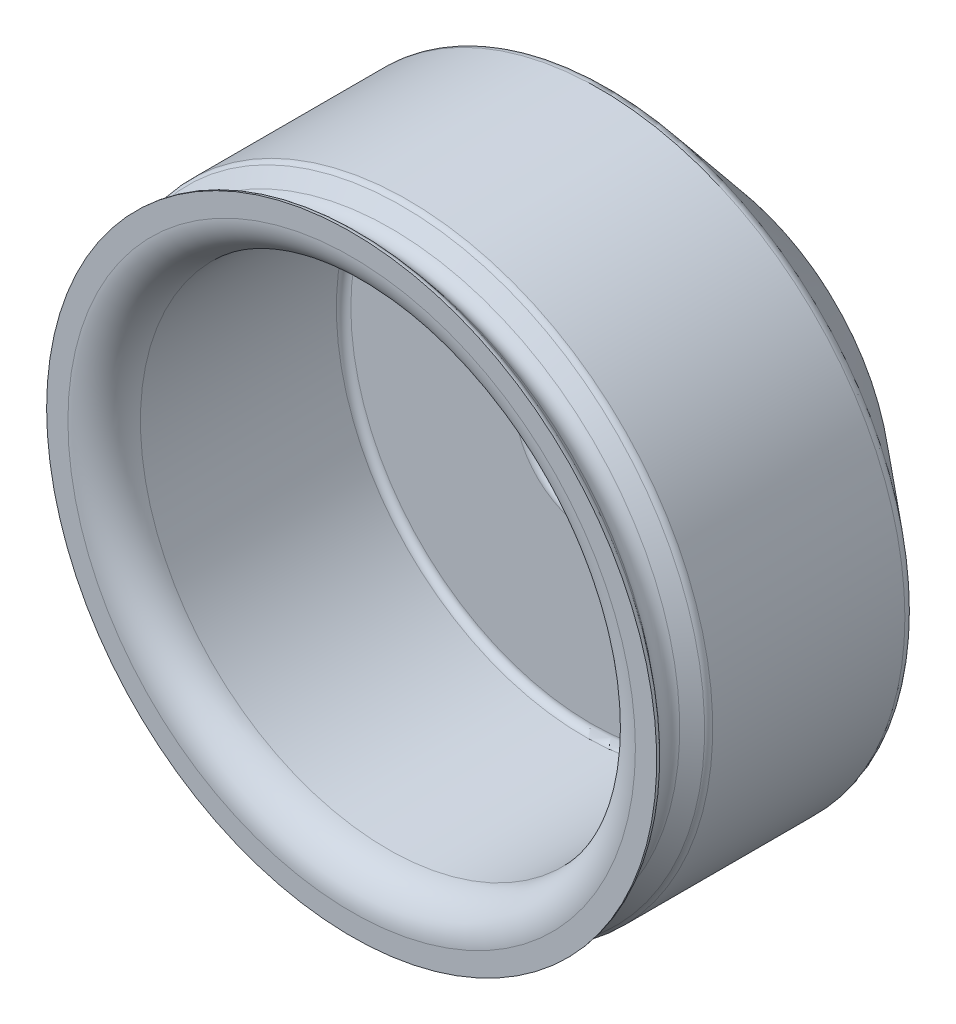
ISO-10303-21;
HEADER;
FILE_DESCRIPTION(('STEP AP214'),'2;1');
FILE_NAME('part.step','',(''),(''),'','','');
FILE_SCHEMA(('AUTOMOTIVE_DESIGN { 1 0 10303 214 1 1 1 1 }'));
ENDSEC;
DATA;
#1=APPLICATION_CONTEXT('core data for automotive mechanical design processes');
#2=APPLICATION_PROTOCOL_DEFINITION('international standard','automotive_design',2000,#1);
#3=PRODUCT_CONTEXT('',#1,'mechanical');
#4=PRODUCT('Part','Part','',(#3));
#5=PRODUCT_RELATED_PRODUCT_CATEGORY('part','',(#4));
#6=PRODUCT_DEFINITION_FORMATION('','',#4);
#7=PRODUCT_DEFINITION_CONTEXT('part definition',#1,'design');
#8=PRODUCT_DEFINITION('design','',#6,#7);
#9=PRODUCT_DEFINITION_SHAPE('','',#8);
#10=(LENGTH_UNIT() NAMED_UNIT(*) SI_UNIT(.MILLI.,.METRE.));
#11=(NAMED_UNIT(*) PLANE_ANGLE_UNIT() SI_UNIT($,.RADIAN.));
#12=(NAMED_UNIT(*) SI_UNIT($,.STERADIAN.) SOLID_ANGLE_UNIT());
#13=UNCERTAINTY_MEASURE_WITH_UNIT(LENGTH_MEASURE(1.E-05),#10,'distance_accuracy_value','');
#14=(GEOMETRIC_REPRESENTATION_CONTEXT(3) GLOBAL_UNCERTAINTY_ASSIGNED_CONTEXT((#13)) GLOBAL_UNIT_ASSIGNED_CONTEXT((#10,
#11,#12)) REPRESENTATION_CONTEXT('',''));
#15=CARTESIAN_POINT('',(0.,0.,0.));
#16=DIRECTION('',(0.,0.,1.));
#17=DIRECTION('',(1.,0.,0.));
#18=AXIS2_PLACEMENT_3D('',#15,#16,#17);
#19=CARTESIAN_POINT('',(0.,0.,0.));
#20=DIRECTION('',(0.,0.,1.));
#21=DIRECTION('',(1.,0.,0.));
#22=AXIS2_PLACEMENT_3D('',#19,#20,#21);
#23=PLANE('',#22);
#24=DIRECTION('',(-1.,0.,0.));
#25=VECTOR('',#24,1.);
#26=CARTESIAN_POINT('',(-1.61844048392272,2.0859,0.));
#27=LINE('',#26,#25);
#28=CARTESIAN_POINT('',(1.86354221846461,2.0859,0.));
#29=VERTEX_POINT('',#28);
#30=CARTESIAN_POINT('',(-1.86354221846461,2.0859,0.));
#31=VERTEX_POINT('',#30);
#32=EDGE_CURVE('E189',#29,#31,#27,.T.);
#33=ORIENTED_EDGE('',*,*,#32,.T.);
#34=CARTESIAN_POINT('',(0.,0.,0.));
#35=DIRECTION('',(0.,0.,1.));
#36=DIRECTION('',(1.,0.,0.));
#37=AXIS2_PLACEMENT_3D('',#34,#35,#36);
#38=CIRCLE('',#37,2.7971);
#39=EDGE_CURVE('E186',#31,#29,#38,.T.);
#40=ORIENTED_EDGE('',*,*,#39,.T.);
#41=EDGE_LOOP('',(#33,#40));
#42=FACE_BOUND('',#41,.T.);
#43=CARTESIAN_POINT('',(0.,0.,0.));
#44=DIRECTION('',(0.,0.,1.));
#45=DIRECTION('',(1.,0.,0.));
#46=AXIS2_PLACEMENT_3D('',#43,#44,#45);
#47=CIRCLE('',#46,9.94959878402376);
#48=CARTESIAN_POINT('',(9.94959878402376,0.,0.));
#49=VERTEX_POINT('',#48);
#50=EDGE_CURVE('E191',#49,#49,#47,.F.);
#51=ORIENTED_EDGE('',*,*,#50,.T.);
#52=EDGE_LOOP('',(#51));
#53=FACE_BOUND('',#52,.T.);
#54=ADVANCED_FACE('F33',(#42,#53),#23,.F.);
#55=CARTESIAN_POINT('',(0.,0.,3.175));
#56=DIRECTION('',(0.,0.,1.));
#57=DIRECTION('',(1.,0.,0.));
#58=AXIS2_PLACEMENT_3D('',#55,#56,#57);
#59=PLANE('',#58);
#60=DIRECTION('',(-1.,0.,0.));
#61=VECTOR('',#60,1.);
#62=CARTESIAN_POINT('',(0.,1.8859,3.175));
#63=LINE('',#62,#61);
#64=CARTESIAN_POINT('',(-1.78558382609162,1.8859,3.175));
#65=VERTEX_POINT('',#64);
#66=CARTESIAN_POINT('',(1.78558382609162,1.8859,3.175));
#67=VERTEX_POINT('',#66);
#68=EDGE_CURVE('E104',#65,#67,#63,.F.);
#69=ORIENTED_EDGE('',*,*,#68,.T.);
#70=CARTESIAN_POINT('',(0.,0.,3.175));
#71=DIRECTION('',(0.,0.,1.));
#72=DIRECTION('',(1.,0.,0.));
#73=AXIS2_PLACEMENT_3D('',#70,#71,#72);
#74=CIRCLE('',#73,2.5971);
#75=EDGE_CURVE('E91',#67,#65,#74,.F.);
#76=ORIENTED_EDGE('',*,*,#75,.T.);
#77=EDGE_LOOP('',(#69,#76));
#78=FACE_BOUND('',#77,.T.);
#79=CARTESIAN_POINT('',(0.,0.,3.175));
#80=DIRECTION('',(0.,0.,1.));
#81=DIRECTION('',(1.,0.,0.));
#82=AXIS2_PLACEMENT_3D('',#79,#80,#81);
#83=CIRCLE('',#82,3.41);
#84=CARTESIAN_POINT('',(3.41,0.,3.175));
#85=VERTEX_POINT('',#84);
#86=EDGE_CURVE('E112',#85,#85,#83,.T.);
#87=ORIENTED_EDGE('',*,*,#86,.T.);
#88=EDGE_LOOP('',(#87));
#89=FACE_BOUND('',#88,.T.);
#90=ADVANCED_FACE('F242',(#78,#89),#59,.T.);
#91=CARTESIAN_POINT('',(0.,0.,3.175));
#92=DIRECTION('',(0.,0.,-1.));
#93=DIRECTION('',(-1.,0.,0.));
#94=AXIS2_PLACEMENT_3D('',#91,#92,#93);
#95=CYLINDRICAL_SURFACE('',#94,2.1971);
#96=DIRECTION('',(0.,0.,-1.));
#97=VECTOR('',#96,1.);
#98=CARTESIAN_POINT('',(1.61844048392272,1.4859,3.175));
#99=LINE('',#98,#97);
#100=CARTESIAN_POINT('',(1.61844048392272,1.4859,2.775));
#101=VERTEX_POINT('',#100);
#102=CARTESIAN_POINT('',(1.61844048392272,1.4859,0.6));
#103=VERTEX_POINT('',#102);
#104=EDGE_CURVE('E85',#101,#103,#99,.T.);
#105=ORIENTED_EDGE('',*,*,#104,.T.);
#106=CARTESIAN_POINT('',(0.,0.,0.6));
#107=DIRECTION('',(0.,0.,1.));
#108=DIRECTION('',(1.,0.,0.));
#109=AXIS2_PLACEMENT_3D('',#106,#107,#108);
#110=CIRCLE('',#109,2.1971);
#111=CARTESIAN_POINT('',(-1.61844048392272,1.4859,0.6));
#112=VERTEX_POINT('',#111);
#113=EDGE_CURVE('E98',#103,#112,#110,.F.);
#114=ORIENTED_EDGE('',*,*,#113,.T.);
#115=DIRECTION('',(0.,0.,-1.));
#116=VECTOR('',#115,1.);
#117=CARTESIAN_POINT('',(-1.61844048392272,1.4859,3.175));
#118=LINE('',#117,#116);
#119=CARTESIAN_POINT('',(-1.61844048392272,1.4859,2.775));
#120=VERTEX_POINT('',#119);
#121=EDGE_CURVE('E84',#120,#112,#118,.T.);
#122=ORIENTED_EDGE('',*,*,#121,.F.);
#123=CARTESIAN_POINT('',(0.,0.,2.775));
#124=DIRECTION('',(0.,0.,1.));
#125=DIRECTION('',(1.,0.,0.));
#126=AXIS2_PLACEMENT_3D('',#123,#124,#125);
#127=CIRCLE('',#126,2.1971);
#128=EDGE_CURVE('E97',#120,#101,#127,.T.);
#129=ORIENTED_EDGE('',*,*,#128,.T.);
#130=EDGE_LOOP('',(#105,#114,#122,#129));
#131=FACE_BOUND('',#130,.T.);
#132=ADVANCED_FACE('F95',(#131),#95,.F.);
#133=CARTESIAN_POINT('',(-1.61844048392272,1.4859,3.175));
#134=DIRECTION('',(0.,-1.,0.));
#135=DIRECTION('',(0.,0.,-1.));
#136=AXIS2_PLACEMENT_3D('',#133,#134,#135);
#137=PLANE('',#136);
#138=ORIENTED_EDGE('',*,*,#121,.T.);
#139=DIRECTION('',(-1.,0.,0.));
#140=VECTOR('',#139,1.);
#141=CARTESIAN_POINT('',(1.61844048392272,1.4859,0.6));
#142=LINE('',#141,#140);
#143=EDGE_CURVE('E55',#112,#103,#142,.F.);
#144=ORIENTED_EDGE('',*,*,#143,.T.);
#145=ORIENTED_EDGE('',*,*,#104,.F.);
#146=DIRECTION('',(-1.,0.,0.));
#147=VECTOR('',#146,1.);
#148=CARTESIAN_POINT('',(-1.61844048392272,1.4859,2.775));
#149=LINE('',#148,#147);
#150=EDGE_CURVE('E81',#101,#120,#149,.T.);
#151=ORIENTED_EDGE('',*,*,#150,.T.);
#152=EDGE_LOOP('',(#138,#144,#145,#151));
#153=FACE_BOUND('',#152,.T.);
#154=ADVANCED_FACE('F83',(#153),#137,.T.);
#155=CARTESIAN_POINT('',(0.,0.,6.35));
#156=DIRECTION('',(0.,0.,1.));
#157=DIRECTION('',(1.,0.,0.));
#158=AXIS2_PLACEMENT_3D('',#155,#156,#157);
#159=PLANE('',#158);
#160=CARTESIAN_POINT('',(0.,0.,6.35));
#161=DIRECTION('',(0.,0.,1.));
#162=DIRECTION('',(1.,0.,0.));
#163=AXIS2_PLACEMENT_3D('',#160,#161,#162);
#164=CIRCLE('',#163,4.21);
#165=CARTESIAN_POINT('',(4.21,0.,6.35));
#166=VERTEX_POINT('',#165);
#167=EDGE_CURVE('E128',#166,#166,#164,.F.);
#168=ORIENTED_EDGE('',*,*,#167,.T.);
#169=EDGE_LOOP('',(#168));
#170=FACE_BOUND('',#169,.T.);
#171=CARTESIAN_POINT('',(0.,0.,6.35));
#172=DIRECTION('',(0.,0.,1.));
#173=DIRECTION('',(1.,0.,0.));
#174=AXIS2_PLACEMENT_3D('',#171,#172,#173);
#175=CIRCLE('',#174,13.2525);
#176=CARTESIAN_POINT('',(13.2525,0.,6.35));
#177=VERTEX_POINT('',#176);
#178=EDGE_CURVE('E125',#177,#177,#175,.T.);
#179=ORIENTED_EDGE('',*,*,#178,.T.);
#180=EDGE_LOOP('',(#179));
#181=FACE_BOUND('',#180,.T.);
#182=ADVANCED_FACE('F255',(#170,#181),#159,.T.);
#183=CARTESIAN_POINT('',(0.,0.,6.35));
#184=DIRECTION('',(0.,0.,-1.));
#185=DIRECTION('',(-1.,0.,0.));
#186=AXIS2_PLACEMENT_3D('',#183,#184,#185);
#187=CYLINDRICAL_SURFACE('',#186,3.81);
#188=CARTESIAN_POINT('',(0.,0.,3.575));
#189=DIRECTION('',(0.,0.,1.));
#190=DIRECTION('',(1.,0.,0.));
#191=AXIS2_PLACEMENT_3D('',#188,#189,#190);
#192=CIRCLE('',#191,3.81);
#193=CARTESIAN_POINT('',(3.81,0.,3.575));
#194=VERTEX_POINT('',#193);
#195=EDGE_CURVE('E122',#194,#194,#192,.F.);
#196=ORIENTED_EDGE('',*,*,#195,.T.);
#197=EDGE_LOOP('',(#196));
#198=FACE_BOUND('',#197,.T.);
#199=CARTESIAN_POINT('',(0.,0.,5.95));
#200=DIRECTION('',(0.,0.,1.));
#201=DIRECTION('',(1.,0.,0.));
#202=AXIS2_PLACEMENT_3D('',#199,#200,#201);
#203=CIRCLE('',#202,3.81);
#204=CARTESIAN_POINT('',(3.81,0.,5.95));
#205=VERTEX_POINT('',#204);
#206=EDGE_CURVE('E90',#205,#205,#203,.T.);
#207=ORIENTED_EDGE('',*,*,#206,.T.);
#208=EDGE_LOOP('',(#207));
#209=FACE_BOUND('',#208,.T.);
#210=ADVANCED_FACE('F258',(#198,#209),#187,.F.);
#211=CARTESIAN_POINT('',(0.,0.,0.));
#212=DIRECTION('',(0.,0.,-1.));
#213=DIRECTION('',(-1.,0.,0.));
#214=AXIS2_PLACEMENT_3D('',#211,#212,#213);
#215=CYLINDRICAL_SURFACE('',#214,13.6525);
#216=CARTESIAN_POINT('',(0.,0.,17.558));
#217=DIRECTION('',(0.,0.,1.));
#218=DIRECTION('',(1.,0.,0.));
#219=AXIS2_PLACEMENT_3D('',#216,#217,#218);
#220=CIRCLE('',#219,13.6525);
#221=CARTESIAN_POINT('',(13.6525,0.,17.558));
#222=VERTEX_POINT('',#221);
#223=EDGE_CURVE('E194',#222,#222,#220,.T.);
#224=ORIENTED_EDGE('',*,*,#223,.T.);
#225=EDGE_LOOP('',(#224));
#226=FACE_BOUND('',#225,.T.);
#227=CARTESIAN_POINT('',(0.,0.,6.75));
#228=DIRECTION('',(0.,0.,1.));
#229=DIRECTION('',(1.,0.,0.));
#230=AXIS2_PLACEMENT_3D('',#227,#228,#229);
#231=CIRCLE('',#230,13.6525);
#232=CARTESIAN_POINT('',(13.6525,0.,6.75));
#233=VERTEX_POINT('',#232);
#234=EDGE_CURVE('E131',#233,#233,#231,.F.);
#235=ORIENTED_EDGE('',*,*,#234,.T.);
#236=EDGE_LOOP('',(#235));
#237=FACE_BOUND('',#236,.T.);
#238=ADVANCED_FACE('F204',(#226,#237),#215,.F.);
#239=CARTESIAN_POINT('',(0.,13.6525,19.558));
#240=DIRECTION('',(0.,0.,1.));
#241=DIRECTION('',(1.,0.,0.));
#242=AXIS2_PLACEMENT_3D('',#239,#240,#241);
#243=PLANE('',#242);
#244=CARTESIAN_POINT('',(0.,0.,19.558));
#245=DIRECTION('',(0.,0.,1.));
#246=DIRECTION('',(1.,0.,0.));
#247=AXIS2_PLACEMENT_3D('',#244,#245,#246);
#248=CIRCLE('',#247,15.6525);
#249=CARTESIAN_POINT('',(15.6525,0.,19.558));
#250=VERTEX_POINT('',#249);
#251=EDGE_CURVE('E134',#250,#250,#248,.F.);
#252=ORIENTED_EDGE('',*,*,#251,.T.);
#253=EDGE_LOOP('',(#252));
#254=FACE_BOUND('',#253,.T.);
#255=CARTESIAN_POINT('',(0.,0.,19.558));
#256=DIRECTION('',(0.,0.,-1.));
#257=DIRECTION('',(-1.,0.,0.));
#258=AXIS2_PLACEMENT_3D('',#255,#256,#257);
#259=CIRCLE('',#258,16.8275);
#260=CARTESIAN_POINT('',(-16.8275,0.,19.558));
#261=VERTEX_POINT('',#260);
#262=EDGE_CURVE('E99',#261,#261,#259,.T.);
#263=ORIENTED_EDGE('',*,*,#262,.F.);
#264=EDGE_LOOP('',(#263));
#265=FACE_BOUND('',#264,.T.);
#266=ADVANCED_FACE('F199',(#254,#265),#243,.T.);
#267=CARTESIAN_POINT('',(0.,0.,19.558));
#268=DIRECTION('',(0.,0.,-1.));
#269=DIRECTION('',(-1.,0.,0.));
#270=AXIS2_PLACEMENT_3D('',#267,#268,#269);
#271=TOROIDAL_SURFACE('',#270,16.4275,0.400000000000002);
#272=ORIENTED_EDGE('',*,*,#262,.T.);
#273=EDGE_LOOP('',(#272));
#274=FACE_BOUND('',#273,.T.);
#275=CARTESIAN_POINT('',(0.,0.,19.2515822227524));
#276=DIRECTION('',(0.,0.,-1.));
#277=DIRECTION('',(-1.,0.,0.));
#278=AXIS2_PLACEMENT_3D('',#275,#276,#277);
#279=CIRCLE('',#278,16.6846150438746);
#280=CARTESIAN_POINT('',(-16.6846150438746,0.,19.2515822227524));
#281=VERTEX_POINT('',#280);
#282=EDGE_CURVE('E209',#281,#281,#279,.T.);
#283=ORIENTED_EDGE('',*,*,#282,.F.);
#284=EDGE_LOOP('',(#283));
#285=FACE_BOUND('',#284,.T.);
#286=ADVANCED_FACE('F203',(#274,#285),#271,.T.);
#287=CARTESIAN_POINT('',(0.,0.,18.6253242980759));
#288=DIRECTION('',(0.,0.,1.));
#289=DIRECTION('',(1.,0.,0.));
#290=AXIS2_PLACEMENT_3D('',#287,#288,#289);
#291=CONICAL_SURFACE('',#290,15.9382699122508,0.872664625997176);
#292=ORIENTED_EDGE('',*,*,#282,.T.);
#293=EDGE_LOOP('',(#292));
#294=FACE_BOUND('',#293,.T.);
#295=CARTESIAN_POINT('',(0.,0.,18.6253242980759));
#296=DIRECTION('',(0.,0.,-1.));
#297=DIRECTION('',(-1.,0.,0.));
#298=AXIS2_PLACEMENT_3D('',#295,#296,#297);
#299=CIRCLE('',#298,15.9382699122508);
#300=CARTESIAN_POINT('',(-15.9382699122508,0.,18.6253242980759));
#301=VERTEX_POINT('',#300);
#302=EDGE_CURVE('E212',#301,#301,#299,.T.);
#303=ORIENTED_EDGE('',*,*,#302,.F.);
#304=EDGE_LOOP('',(#303));
#305=FACE_BOUND('',#304,.T.);
#306=ADVANCED_FACE('F268',(#294,#305),#291,.T.);
#307=CARTESIAN_POINT('',(0.,0.,18.0124887435807));
#308=DIRECTION('',(0.,0.,-1.));
#309=DIRECTION('',(-1.,0.,0.));
#310=AXIS2_PLACEMENT_3D('',#307,#308,#309);
#311=TOROIDAL_SURFACE('',#310,16.4525,0.800000000000003);
#312=ORIENTED_EDGE('',*,*,#302,.T.);
#313=EDGE_LOOP('',(#312));
#314=FACE_BOUND('',#313,.T.);
#315=CARTESIAN_POINT('',(0.,0.,17.3996531890855));
#316=DIRECTION('',(0.,0.,-1.));
#317=DIRECTION('',(-1.,0.,0.));
#318=AXIS2_PLACEMENT_3D('',#315,#316,#317);
#319=CIRCLE('',#318,15.9382699122508);
#320=CARTESIAN_POINT('',(-15.9382699122508,0.,17.3996531890855));
#321=VERTEX_POINT('',#320);
#322=EDGE_CURVE('E217',#321,#321,#319,.T.);
#323=ORIENTED_EDGE('',*,*,#322,.F.);
#324=EDGE_LOOP('',(#323));
#325=FACE_BOUND('',#324,.T.);
#326=ADVANCED_FACE('F238',(#314,#325),#311,.F.);
#327=CARTESIAN_POINT('',(0.,0.,16.773395264409));
#328=DIRECTION('',(0.,0.,-1.));
#329=DIRECTION('',(-1.,0.,0.));
#330=AXIS2_PLACEMENT_3D('',#327,#328,#329);
#331=CONICAL_SURFACE('',#330,16.6846150438746,0.872664625997173);
#332=ORIENTED_EDGE('',*,*,#322,.T.);
#333=EDGE_LOOP('',(#332));
#334=FACE_BOUND('',#333,.T.);
#335=CARTESIAN_POINT('',(0.,0.,16.773395264409));
#336=DIRECTION('',(0.,0.,-1.));
#337=DIRECTION('',(-1.,0.,0.));
#338=AXIS2_PLACEMENT_3D('',#335,#336,#337);
#339=CIRCLE('',#338,16.6846150438746);
#340=CARTESIAN_POINT('',(-16.6846150438746,0.,16.773395264409));
#341=VERTEX_POINT('',#340);
#342=EDGE_CURVE('E220',#341,#341,#339,.T.);
#343=ORIENTED_EDGE('',*,*,#342,.F.);
#344=EDGE_LOOP('',(#343));
#345=FACE_BOUND('',#344,.T.);
#346=ADVANCED_FACE('F229',(#334,#345),#331,.T.);
#347=CARTESIAN_POINT('',(0.,0.,16.4669774871614));
#348=DIRECTION('',(0.,0.,-1.));
#349=DIRECTION('',(-1.,0.,0.));
#350=AXIS2_PLACEMENT_3D('',#347,#348,#349);
#351=TOROIDAL_SURFACE('',#350,16.4275,0.400000000000004);
#352=ORIENTED_EDGE('',*,*,#342,.T.);
#353=EDGE_LOOP('',(#352));
#354=FACE_BOUND('',#353,.T.);
#355=CARTESIAN_POINT('',(0.,0.,16.4669774871614));
#356=DIRECTION('',(0.,0.,-1.));
#357=DIRECTION('',(-1.,0.,0.));
#358=AXIS2_PLACEMENT_3D('',#355,#356,#357);
#359=CIRCLE('',#358,16.8275);
#360=CARTESIAN_POINT('',(-16.8275,0.,16.4669774871614));
#361=VERTEX_POINT('',#360);
#362=EDGE_CURVE('E108',#361,#361,#359,.T.);
#363=ORIENTED_EDGE('',*,*,#362,.F.);
#364=EDGE_LOOP('',(#363));
#365=FACE_BOUND('',#364,.T.);
#366=ADVANCED_FACE('F227',(#354,#365),#351,.T.);
#367=CARTESIAN_POINT('',(0.,0.,0.));
#368=DIRECTION('',(0.,0.,-1.));
#369=DIRECTION('',(-1.,0.,0.));
#370=AXIS2_PLACEMENT_3D('',#367,#368,#369);
#371=CYLINDRICAL_SURFACE('',#370,16.8275);
#372=CARTESIAN_POINT('',(0.,0.,5.867784594893));
#373=DIRECTION('',(0.,0.,1.));
#374=DIRECTION('',(1.,0.,0.));
#375=AXIS2_PLACEMENT_3D('',#372,#373,#374);
#376=CIRCLE('',#375,16.8275);
#377=CARTESIAN_POINT('',(16.8275,0.,5.867784594893));
#378=VERTEX_POINT('',#377);
#379=EDGE_CURVE('E11',#378,#378,#376,.T.);
#380=ORIENTED_EDGE('',*,*,#379,.T.);
#381=EDGE_LOOP('',(#380));
#382=FACE_BOUND('',#381,.T.);
#383=ORIENTED_EDGE('',*,*,#362,.T.);
#384=EDGE_LOOP('',(#383));
#385=FACE_BOUND('',#384,.T.);
#386=ADVANCED_FACE('F149',(#382,#385),#371,.T.);
#387=CARTESIAN_POINT('',(-1.61844048392272,1.8859,2.775));
#388=DIRECTION('',(-1.,0.,0.));
#389=DIRECTION('',(0.,0.,1.));
#390=AXIS2_PLACEMENT_3D('',#387,#388,#389);
#391=CYLINDRICAL_SURFACE('',#390,0.4);
#392=CARTESIAN_POINT('',(1.61844048392272,1.4859,2.775));
#393=CARTESIAN_POINT('',(1.6184279251195,1.48587573243473,2.79617683701473));
#394=CARTESIAN_POINT('',(1.61917873967295,1.48758000154117,2.81733593506487));
#395=CARTESIAN_POINT('',(1.62210805299891,1.49425292577185,2.85896553890415));
#396=CARTESIAN_POINT('',(1.6242820502049,1.4992112882317,2.87943800261027));
#397=CARTESIAN_POINT('',(1.62995857522217,1.51219910536874,2.9191734314972));
#398=CARTESIAN_POINT('',(1.63346053515159,1.52022724731647,2.93843690958296));
#399=CARTESIAN_POINT('',(1.64163303116618,1.53904444357606,2.97529844578131));
#400=CARTESIAN_POINT('',(1.64630414189129,1.54983485560873,2.9928956790518));
#401=CARTESIAN_POINT('',(1.65681963784184,1.57425292489883,3.0266460617728));
#402=CARTESIAN_POINT('',(1.66270059258753,1.58796968749708,3.04272316282571));
#403=CARTESIAN_POINT('',(1.6753069572211,1.6175535979896,3.0723703540475));
#404=CARTESIAN_POINT('',(1.68203265628696,1.63342148241718,3.08593958175576));
#405=CARTESIAN_POINT('',(1.6966787362034,1.66820556178198,3.11131622850045));
#406=CARTESIAN_POINT('',(1.70465155742049,1.68726368856272,3.12289871021104));
#407=CARTESIAN_POINT('',(1.72109369570914,1.72686341330359,3.14269202334142));
#408=CARTESIAN_POINT('',(1.72956315862959,1.74740544745806,3.1509018585912));
#409=CARTESIAN_POINT('',(1.74566832507443,1.78676600737856,3.16299628692281));
#410=CARTESIAN_POINT('',(1.75327295204829,1.80547114153928,3.16729837974999));
#411=CARTESIAN_POINT('',(1.7685330007565,1.84325474728501,3.17317791136736));
#412=CARTESIAN_POINT('',(1.77618828947558,1.86233239182,3.17476081579639));
#413=CARTESIAN_POINT('',(1.78439356963569,1.88291240766148,3.17499165076643));
#414=CARTESIAN_POINT('',(1.78498885626196,1.88440622451286,3.17500002114534));
#415=CARTESIAN_POINT('',(1.78558382609162,1.8859,3.175));
#416=B_SPLINE_CURVE_WITH_KNOTS('',3,(#392,#393,#394,#395,#396,#397,#398,#399,#400,#401,#402,
#403,#404,#405,#406,#407,#408,#409,#410,#411,#412,#413,#414,#415),.UNSPECIFIED.,.F.,.F.,(4,2,2,
2,2,2,2,2,2,2,2,4),(0.,0.0634211449991186,0.126642650147228,0.189837150070465,0.253062771419776,
0.318593704247308,0.384147131476207,0.454897202520991,0.525668155835106,0.587431892490301,
0.649071336544128,0.653895478651192),.UNSPECIFIED.);
#417=EDGE_CURVE('E109',#67,#101,#416,.F.);
#418=ORIENTED_EDGE('',*,*,#417,.F.);
#419=ORIENTED_EDGE('',*,*,#68,.F.);
#420=CARTESIAN_POINT('',(-1.61844048392272,1.4859,2.775));
#421=CARTESIAN_POINT('',(-1.6184279251195,1.48587573243473,2.79617683701473));
#422=CARTESIAN_POINT('',(-1.61917873967295,1.48758000154117,2.81733593506487));
#423=CARTESIAN_POINT('',(-1.62210805299891,1.49425292577185,2.85896553890415));
#424=CARTESIAN_POINT('',(-1.6242820502049,1.4992112882317,2.87943800261027));
#425=CARTESIAN_POINT('',(-1.62995857522217,1.51219910536874,2.9191734314972));
#426=CARTESIAN_POINT('',(-1.63346053515159,1.52022724731647,2.93843690958296));
#427=CARTESIAN_POINT('',(-1.64163303116618,1.53904444357606,2.97529844578131));
#428=CARTESIAN_POINT('',(-1.64630414189129,1.54983485560873,2.9928956790518));
#429=CARTESIAN_POINT('',(-1.65681963784184,1.57425292489883,3.0266460617728));
#430=CARTESIAN_POINT('',(-1.66270059258753,1.58796968749708,3.04272316282571));
#431=CARTESIAN_POINT('',(-1.6753069572211,1.6175535979896,3.0723703540475));
#432=CARTESIAN_POINT('',(-1.68203265628696,1.63342148241718,3.08593958175576));
#433=CARTESIAN_POINT('',(-1.6966787362034,1.66820556178198,3.11131622850045));
#434=CARTESIAN_POINT('',(-1.70465155742049,1.68726368856272,3.12289871021104));
#435=CARTESIAN_POINT('',(-1.72109369570914,1.72686341330359,3.14269202334142));
#436=CARTESIAN_POINT('',(-1.72956315862959,1.74740544745806,3.1509018585912));
#437=CARTESIAN_POINT('',(-1.74566832507443,1.78676600737856,3.16299628692281));
#438=CARTESIAN_POINT('',(-1.75327295204829,1.80547114153928,3.16729837974999));
#439=CARTESIAN_POINT('',(-1.7685330007565,1.84325474728501,3.17317791136736));
#440=CARTESIAN_POINT('',(-1.77618828947558,1.86233239182,3.17476081579639));
#441=CARTESIAN_POINT('',(-1.78439356963569,1.88291240766148,3.17499165076643));
#442=CARTESIAN_POINT('',(-1.78498885626196,1.88440622451286,3.17500002114534));
#443=CARTESIAN_POINT('',(-1.78558382609162,1.8859,3.175));
#444=B_SPLINE_CURVE_WITH_KNOTS('',3,(#420,#421,#422,#423,#424,#425,#426,#427,#428,#429,#430,
#431,#432,#433,#434,#435,#436,#437,#438,#439,#440,#441,#442,#443),.UNSPECIFIED.,.F.,.F.,(4,2,2,
2,2,2,2,2,2,2,2,4),(0.,0.0634211449991186,0.126642650147228,0.189837150070465,0.253062771419776,
0.318593704247308,0.384147131476207,0.454897202520991,0.525668155835106,0.587431892490301,
0.649071336544128,0.653895478651192),.UNSPECIFIED.);
#445=EDGE_CURVE('E102',#120,#65,#444,.T.);
#446=ORIENTED_EDGE('',*,*,#445,.F.);
#447=ORIENTED_EDGE('',*,*,#150,.F.);
#448=EDGE_LOOP('',(#418,#419,#446,#447));
#449=FACE_BOUND('',#448,.T.);
#450=ADVANCED_FACE('F103',(#449),#391,.T.);
#451=CARTESIAN_POINT('',(0.,0.,2.775));
#452=DIRECTION('',(0.,0.,1.));
#453=DIRECTION('',(1.,0.,0.));
#454=AXIS2_PLACEMENT_3D('',#451,#452,#453);
#455=TOROIDAL_SURFACE('',#454,2.5971,0.4);
#456=ORIENTED_EDGE('',*,*,#445,.T.);
#457=ORIENTED_EDGE('',*,*,#75,.F.);
#458=ORIENTED_EDGE('',*,*,#417,.T.);
#459=ORIENTED_EDGE('',*,*,#128,.F.);
#460=EDGE_LOOP('',(#456,#457,#458,#459));
#461=FACE_BOUND('',#460,.T.);
#462=ADVANCED_FACE('F111',(#461),#455,.T.);
#463=CARTESIAN_POINT('',(0.,0.,3.575));
#464=DIRECTION('',(0.,0.,1.));
#465=DIRECTION('',(1.,0.,0.));
#466=AXIS2_PLACEMENT_3D('',#463,#464,#465);
#467=TOROIDAL_SURFACE('',#466,3.41,0.4);
#468=ORIENTED_EDGE('',*,*,#86,.F.);
#469=EDGE_LOOP('',(#468));
#470=FACE_BOUND('',#469,.T.);
#471=ORIENTED_EDGE('',*,*,#195,.F.);
#472=EDGE_LOOP('',(#471));
#473=FACE_BOUND('',#472,.T.);
#474=ADVANCED_FACE('F150',(#470,#473),#467,.F.);
#475=CARTESIAN_POINT('',(0.,0.,5.95));
#476=DIRECTION('',(0.,0.,1.));
#477=DIRECTION('',(1.,0.,0.));
#478=AXIS2_PLACEMENT_3D('',#475,#476,#477);
#479=TOROIDAL_SURFACE('',#478,4.21,0.4);
#480=ORIENTED_EDGE('',*,*,#167,.F.);
#481=EDGE_LOOP('',(#480));
#482=FACE_BOUND('',#481,.T.);
#483=ORIENTED_EDGE('',*,*,#206,.F.);
#484=EDGE_LOOP('',(#483));
#485=FACE_BOUND('',#484,.T.);
#486=ADVANCED_FACE('F154',(#482,#485),#479,.T.);
#487=CARTESIAN_POINT('',(0.,0.,6.75));
#488=DIRECTION('',(0.,0.,1.));
#489=DIRECTION('',(1.,0.,0.));
#490=AXIS2_PLACEMENT_3D('',#487,#488,#489);
#491=TOROIDAL_SURFACE('',#490,13.2525,0.4);
#492=ORIENTED_EDGE('',*,*,#178,.F.);
#493=EDGE_LOOP('',(#492));
#494=FACE_BOUND('',#493,.T.);
#495=ORIENTED_EDGE('',*,*,#234,.F.);
#496=EDGE_LOOP('',(#495));
#497=FACE_BOUND('',#496,.T.);
#498=ADVANCED_FACE('F158',(#494,#497),#491,.F.);
#499=CARTESIAN_POINT('',(0.,0.,5.588));
#500=DIRECTION('',(0.,0.,1.));
#501=DIRECTION('',(1.,0.,0.));
#502=AXIS2_PLACEMENT_3D('',#499,#500,#501);
#503=CONICAL_SURFACE('',#502,16.8275,0.872664625997171);
#504=CARTESIAN_POINT('',(0.,0.,0.140373334128611));
#505=DIRECTION('',(0.,0.,-1.));
#506=DIRECTION('',(-1.,0.,0.));
#507=AXIS2_PLACEMENT_3D('',#504,#505,#506);
#508=CIRCLE('',#507,10.3352713498357);
#509=CARTESIAN_POINT('',(-10.3352713498357,0.,0.140373334128611));
#510=VERTEX_POINT('',#509);
#511=EDGE_CURVE('E47',#510,#510,#508,.F.);
#512=ORIENTED_EDGE('',*,*,#511,.T.);
#513=EDGE_LOOP('',(#512));
#514=FACE_BOUND('',#513,.T.);
#515=CARTESIAN_POINT('',(0.,0.,5.40815792902161));
#516=DIRECTION('',(0.,0.,1.));
#517=DIRECTION('',(1.,0.,0.));
#518=AXIS2_PLACEMENT_3D('',#515,#516,#517);
#519=CIRCLE('',#518,16.6131725658119);
#520=CARTESIAN_POINT('',(16.6131725658119,0.,5.40815792902161));
#521=VERTEX_POINT('',#520);
#522=EDGE_CURVE('E181',#521,#521,#519,.F.);
#523=ORIENTED_EDGE('',*,*,#522,.T.);
#524=EDGE_LOOP('',(#523));
#525=FACE_BOUND('',#524,.T.);
#526=ADVANCED_FACE('F162',(#514,#525),#503,.T.);
#527=CARTESIAN_POINT('',(0.,0.,17.558));
#528=DIRECTION('',(0.,0.,1.));
#529=DIRECTION('',(1.,0.,0.));
#530=AXIS2_PLACEMENT_3D('',#527,#528,#529);
#531=TOROIDAL_SURFACE('',#530,15.6525,2.);
#532=ORIENTED_EDGE('',*,*,#223,.F.);
#533=EDGE_LOOP('',(#532));
#534=FACE_BOUND('',#533,.T.);
#535=ORIENTED_EDGE('',*,*,#251,.F.);
#536=EDGE_LOOP('',(#535));
#537=FACE_BOUND('',#536,.T.);
#538=ADVANCED_FACE('F164',(#534,#537),#531,.T.);
#539=CARTESIAN_POINT('',(0.,2.0859,0.6));
#540=DIRECTION('',(1.,0.,0.));
#541=DIRECTION('',(0.,0.,-1.));
#542=AXIS2_PLACEMENT_3D('',#539,#540,#541);
#543=CYLINDRICAL_SURFACE('',#542,0.6);
#544=CARTESIAN_POINT('',(1.61844048392272,1.4859,0.6));
#545=CARTESIAN_POINT('',(1.61842028969354,1.48586367663224,0.568207763104457));
#546=CARTESIAN_POINT('',(1.61954976115341,1.48842428018443,0.536442878945791));
#547=CARTESIAN_POINT('',(1.62394859427741,1.49844996209034,0.473949536577251));
#548=CARTESIAN_POINT('',(1.6272110952006,1.50589931640564,0.443218086484456));
#549=CARTESIAN_POINT('',(1.63571642072597,1.52541192271606,0.383572343543199));
#550=CARTESIAN_POINT('',(1.64095833007687,1.53747304232663,0.354657218047367));
#551=CARTESIAN_POINT('',(1.65316707676611,1.56574701962075,0.299323628388115));
#552=CARTESIAN_POINT('',(1.66013480491955,1.58196202156041,0.272906463356822));
#553=CARTESIAN_POINT('',(1.67579322323371,1.61868265914398,0.222211498154894));
#554=CARTESIAN_POINT('',(1.68453861838413,1.63932611532345,0.198050703937752));
#555=CARTESIAN_POINT('',(1.70324094923241,1.68387011593716,0.1534967964191));
#556=CARTESIAN_POINT('',(1.71319829854842,1.70777177267239,0.133104975413837));
#557=CARTESIAN_POINT('',(1.73482115950329,1.76017528295287,0.0949912127835749));
#558=CARTESIAN_POINT('',(1.74655940613986,1.78889098699224,0.0776046758414843));
#559=CARTESIAN_POINT('',(1.77070165722492,1.84858919717603,0.0479176211002075));
#560=CARTESIAN_POINT('',(1.78310583816362,1.87957230504045,0.0356184591830317));
#561=CARTESIAN_POINT('',(1.80652909376802,1.93871172776477,0.0176268920887932));
#562=CARTESIAN_POINT('',(1.81750869167643,1.96668386494744,0.0112660592656631));
#563=CARTESIAN_POINT('',(1.83948946512154,2.02319723649408,0.00260345762039259));
#564=CARTESIAN_POINT('',(1.85049055000359,2.05173718379523,0.000293377578949304));
#565=CARTESIAN_POINT('',(1.86211522406375,2.0821619419741,8.71279797757581E-06));
#566=CARTESIAN_POINT('',(1.86282893088254,2.08403097861601,-2.28210281712272E-08));
#567=CARTESIAN_POINT('',(1.86354221846461,2.0859,0.));
#568=B_SPLINE_CURVE_WITH_KNOTS('',3,(#544,#545,#546,#547,#548,#549,#550,#551,#552,#553,#554,
#555,#556,#557,#558,#559,#560,#561,#562,#563,#564,#565,#566,#567),.UNSPECIFIED.,.F.,.F.,(4,2,2,
2,2,2,2,2,2,2,2,4),(0.,0.0952111253236119,0.190117507355791,0.284980059608791,0.379891679437376,
0.478353972425166,0.576849963544104,0.683080567975528,0.789339466665129,0.88123180576542,
0.972935381193161,0.978937355680994),.UNSPECIFIED.);
#569=EDGE_CURVE('E174',#103,#29,#568,.T.);
#570=ORIENTED_EDGE('',*,*,#569,.F.);
#571=ORIENTED_EDGE('',*,*,#143,.F.);
#572=CARTESIAN_POINT('',(-1.61844048392272,1.4859,0.6));
#573=CARTESIAN_POINT('',(-1.61842028969354,1.48586367663224,0.568207763104457));
#574=CARTESIAN_POINT('',(-1.61954976115341,1.48842428018443,0.536442878945791));
#575=CARTESIAN_POINT('',(-1.62394859427741,1.49844996209034,0.473949536577251));
#576=CARTESIAN_POINT('',(-1.6272110952006,1.50589931640564,0.443218086484456));
#577=CARTESIAN_POINT('',(-1.63571642072597,1.52541192271606,0.383572343543199));
#578=CARTESIAN_POINT('',(-1.64095833007687,1.53747304232663,0.354657218047367));
#579=CARTESIAN_POINT('',(-1.65316707676611,1.56574701962075,0.299323628388115));
#580=CARTESIAN_POINT('',(-1.66013480491955,1.58196202156041,0.272906463356822));
#581=CARTESIAN_POINT('',(-1.67579322323371,1.61868265914398,0.222211498154894));
#582=CARTESIAN_POINT('',(-1.68453861838413,1.63932611532345,0.198050703937752));
#583=CARTESIAN_POINT('',(-1.70324094923241,1.68387011593716,0.1534967964191));
#584=CARTESIAN_POINT('',(-1.71319829854842,1.70777177267239,0.133104975413837));
#585=CARTESIAN_POINT('',(-1.73482115950329,1.76017528295287,0.0949912127835749));
#586=CARTESIAN_POINT('',(-1.74655940613986,1.78889098699224,0.0776046758414843));
#587=CARTESIAN_POINT('',(-1.77070165722492,1.84858919717603,0.0479176211002075));
#588=CARTESIAN_POINT('',(-1.78310583816362,1.87957230504045,0.0356184591830317));
#589=CARTESIAN_POINT('',(-1.80652909376802,1.93871172776477,0.0176268920887932));
#590=CARTESIAN_POINT('',(-1.81750869167643,1.96668386494744,0.0112660592656631));
#591=CARTESIAN_POINT('',(-1.83948946512154,2.02319723649408,0.00260345762039259));
#592=CARTESIAN_POINT('',(-1.85049055000359,2.05173718379523,0.000293377578949304));
#593=CARTESIAN_POINT('',(-1.86211522406375,2.0821619419741,8.71279797757581E-06));
#594=CARTESIAN_POINT('',(-1.86282893088254,2.08403097861601,-2.28210281712272E-08));
#595=CARTESIAN_POINT('',(-1.86354221846461,2.0859,0.));
#596=B_SPLINE_CURVE_WITH_KNOTS('',3,(#572,#573,#574,#575,#576,#577,#578,#579,#580,#581,#582,
#583,#584,#585,#586,#587,#588,#589,#590,#591,#592,#593,#594,#595),.UNSPECIFIED.,.F.,.F.,(4,2,2,
2,2,2,2,2,2,2,2,4),(0.,0.0952111253236119,0.190117507355791,0.284980059608791,0.379891679437376,
0.478353972425166,0.576849963544104,0.683080567975528,0.789339466665129,0.88123180576542,
0.972935381193161,0.978937355680994),.UNSPECIFIED.);
#597=EDGE_CURVE('E37',#31,#112,#596,.F.);
#598=ORIENTED_EDGE('',*,*,#597,.F.);
#599=ORIENTED_EDGE('',*,*,#32,.F.);
#600=EDGE_LOOP('',(#570,#571,#598,#599));
#601=FACE_BOUND('',#600,.T.);
#602=ADVANCED_FACE('F166',(#601),#543,.T.);
#603=CARTESIAN_POINT('',(0.,0.,0.6));
#604=DIRECTION('',(0.,0.,1.));
#605=DIRECTION('',(1.,0.,0.));
#606=AXIS2_PLACEMENT_3D('',#603,#604,#605);
#607=TOROIDAL_SURFACE('',#606,2.7971,0.6);
#608=ORIENTED_EDGE('',*,*,#597,.T.);
#609=ORIENTED_EDGE('',*,*,#113,.F.);
#610=ORIENTED_EDGE('',*,*,#569,.T.);
#611=ORIENTED_EDGE('',*,*,#39,.F.);
#612=EDGE_LOOP('',(#608,#609,#610,#611));
#613=FACE_BOUND('',#612,.T.);
#614=ADVANCED_FACE('F170',(#613),#607,.T.);
#615=CARTESIAN_POINT('',(0.,0.,0.6));
#616=DIRECTION('',(0.,0.,1.));
#617=DIRECTION('',(1.,0.,0.));
#618=AXIS2_PLACEMENT_3D('',#615,#616,#617);
#619=TOROIDAL_SURFACE('',#618,9.94959878402376,0.6);
#620=ORIENTED_EDGE('',*,*,#511,.F.);
#621=EDGE_LOOP('',(#620));
#622=FACE_BOUND('',#621,.T.);
#623=ORIENTED_EDGE('',*,*,#50,.F.);
#624=EDGE_LOOP('',(#623));
#625=FACE_BOUND('',#624,.T.);
#626=ADVANCED_FACE('F407',(#622,#625),#619,.T.);
#627=CARTESIAN_POINT('',(0.,0.,5.867784594893));
#628=DIRECTION('',(0.,0.,1.));
#629=DIRECTION('',(1.,0.,0.));
#630=AXIS2_PLACEMENT_3D('',#627,#628,#629);
#631=TOROIDAL_SURFACE('',#630,16.2275,0.6);
#632=ORIENTED_EDGE('',*,*,#379,.F.);
#633=EDGE_LOOP('',(#632));
#634=FACE_BOUND('',#633,.T.);
#635=ORIENTED_EDGE('',*,*,#522,.F.);
#636=EDGE_LOOP('',(#635));
#637=FACE_BOUND('',#636,.T.);
#638=ADVANCED_FACE('F35',(#634,#637),#631,.T.);
#639=CLOSED_SHELL('',(#54,#90,#132,#154,#182,#210,#238,#266,#286,#306,#326,#346,#366,#386,#450,
#462,#474,#486,#498,#526,#538,#602,#614,#626,#638));
#640=MANIFOLD_SOLID_BREP('B2',#639);
#641=ADVANCED_BREP_SHAPE_REPRESENTATION('',(#18,#640),#14);
#642=SHAPE_DEFINITION_REPRESENTATION(#9,#641);
ENDSEC;
END-ISO-10303-21;
